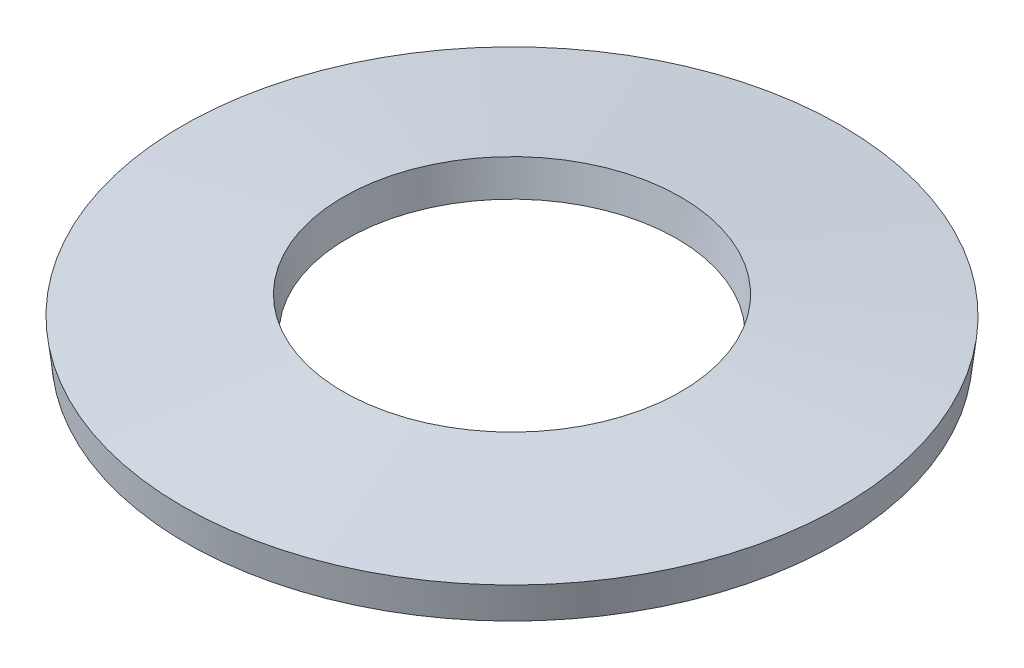
ISO-10303-21;
HEADER;
FILE_DESCRIPTION(('STEP AP214'),'2;1');
FILE_NAME('part.step','',(''),(''),'','','');
FILE_SCHEMA(('AUTOMOTIVE_DESIGN { 1 0 10303 214 1 1 1 1 }'));
ENDSEC;
DATA;
#1=APPLICATION_CONTEXT('core data for automotive mechanical design processes');
#2=APPLICATION_PROTOCOL_DEFINITION('international standard','automotive_design',2000,#1);
#3=PRODUCT_CONTEXT('',#1,'mechanical');
#4=PRODUCT('Part','Part','',(#3));
#5=PRODUCT_RELATED_PRODUCT_CATEGORY('part','',(#4));
#6=PRODUCT_DEFINITION_FORMATION('','',#4);
#7=PRODUCT_DEFINITION_CONTEXT('part definition',#1,'design');
#8=PRODUCT_DEFINITION('design','',#6,#7);
#9=PRODUCT_DEFINITION_SHAPE('','',#8);
#10=(LENGTH_UNIT() NAMED_UNIT(*) SI_UNIT(.MILLI.,.METRE.));
#11=(NAMED_UNIT(*) PLANE_ANGLE_UNIT() SI_UNIT($,.RADIAN.));
#12=(NAMED_UNIT(*) SI_UNIT($,.STERADIAN.) SOLID_ANGLE_UNIT());
#13=UNCERTAINTY_MEASURE_WITH_UNIT(LENGTH_MEASURE(1.E-05),#10,'distance_accuracy_value','');
#14=(GEOMETRIC_REPRESENTATION_CONTEXT(3) GLOBAL_UNCERTAINTY_ASSIGNED_CONTEXT((#13)) GLOBAL_UNIT_ASSIGNED_CONTEXT((#10,
#11,#12)) REPRESENTATION_CONTEXT('',''));
#15=CARTESIAN_POINT('',(0.,0.,0.));
#16=DIRECTION('',(0.,0.,1.));
#17=DIRECTION('',(1.,0.,0.));
#18=AXIS2_PLACEMENT_3D('',#15,#16,#17);
#19=CARTESIAN_POINT('',(0.,0.,0.));
#20=DIRECTION('',(0.,1.,0.));
#21=DIRECTION('',(0.,0.,1.));
#22=AXIS2_PLACEMENT_3D('',#19,#20,#21);
#23=CONICAL_SURFACE('',#22,3.13689420026131,0.115659874957986);
#24=CARTESIAN_POINT('',(0.,0.327993884129375,0.));
#25=DIRECTION('',(0.,-1.,0.));
#26=DIRECTION('',(0.,0.,-1.));
#27=AXIS2_PLACEMENT_3D('',#24,#25,#26);
#28=CIRCLE('',#27,3.175);
#29=CARTESIAN_POINT('',(0.,0.327993884129375,-3.175));
#30=VERTEX_POINT('',#29);
#31=EDGE_CURVE('E43',#30,#30,#28,.T.);
#32=ORIENTED_EDGE('',*,*,#31,.T.);
#33=EDGE_LOOP('',(#32));
#34=FACE_BOUND('',#33,.T.);
#35=CARTESIAN_POINT('',(0.,0.,0.));
#36=DIRECTION('',(0.,-1.,0.));
#37=DIRECTION('',(0.,0.,-1.));
#38=AXIS2_PLACEMENT_3D('',#35,#36,#37);
#39=CIRCLE('',#38,3.13689420026131);
#40=CARTESIAN_POINT('',(0.,0.,-3.13689420026131));
#41=VERTEX_POINT('',#40);
#42=EDGE_CURVE('E10',#41,#41,#39,.T.);
#43=ORIENTED_EDGE('',*,*,#42,.F.);
#44=EDGE_LOOP('',(#43));
#45=FACE_BOUND('',#44,.T.);
#46=ADVANCED_FACE('F29',(#34,#45),#23,.T.);
#47=CARTESIAN_POINT('',(0.,0.180006115870622,0.));
#48=DIRECTION('',(0.,-1.,0.));
#49=DIRECTION('',(0.,0.,-1.));
#50=AXIS2_PLACEMENT_3D('',#47,#48,#49);
#51=CONICAL_SURFACE('',#50,1.5875,1.4551364518369);
#52=ORIENTED_EDGE('',*,*,#42,.T.);
#53=EDGE_LOOP('',(#52));
#54=FACE_BOUND('',#53,.T.);
#55=CARTESIAN_POINT('',(0.,0.180006115870622,0.));
#56=DIRECTION('',(0.,-1.,0.));
#57=DIRECTION('',(0.,0.,-1.));
#58=AXIS2_PLACEMENT_3D('',#55,#56,#57);
#59=CIRCLE('',#58,1.5875);
#60=CARTESIAN_POINT('',(0.,0.180006115870622,-1.5875));
#61=VERTEX_POINT('',#60);
#62=EDGE_CURVE('E35',#61,#61,#59,.T.);
#63=ORIENTED_EDGE('',*,*,#62,.F.);
#64=EDGE_LOOP('',(#63));
#65=FACE_BOUND('',#64,.T.);
#66=ADVANCED_FACE('F59',(#54,#65),#51,.F.);
#67=CARTESIAN_POINT('',(0.,0.507999999999998,0.));
#68=DIRECTION('',(0.,1.,0.));
#69=DIRECTION('',(0.,0.,1.));
#70=AXIS2_PLACEMENT_3D('',#67,#68,#69);
#71=CONICAL_SURFACE('',#70,1.62560579973869,0.115659874958007);
#72=ORIENTED_EDGE('',*,*,#62,.T.);
#73=EDGE_LOOP('',(#72));
#74=FACE_BOUND('',#73,.T.);
#75=CARTESIAN_POINT('',(0.,0.507999999999998,0.));
#76=DIRECTION('',(0.,-1.,0.));
#77=DIRECTION('',(0.,0.,-1.));
#78=AXIS2_PLACEMENT_3D('',#75,#76,#77);
#79=CIRCLE('',#78,1.62560579973869);
#80=CARTESIAN_POINT('',(0.,0.507999999999998,-1.62560579973869));
#81=VERTEX_POINT('',#80);
#82=EDGE_CURVE('E39',#81,#81,#79,.T.);
#83=ORIENTED_EDGE('',*,*,#82,.F.);
#84=EDGE_LOOP('',(#83));
#85=FACE_BOUND('',#84,.T.);
#86=ADVANCED_FACE('F53',(#74,#85),#71,.F.);
#87=CARTESIAN_POINT('',(0.,0.327993884129375,0.));
#88=DIRECTION('',(0.,-1.,0.));
#89=DIRECTION('',(0.,0.,-1.));
#90=AXIS2_PLACEMENT_3D('',#87,#88,#89);
#91=CONICAL_SURFACE('',#90,3.175,1.4551364518369);
#92=ORIENTED_EDGE('',*,*,#82,.T.);
#93=EDGE_LOOP('',(#92));
#94=FACE_BOUND('',#93,.T.);
#95=ORIENTED_EDGE('',*,*,#31,.F.);
#96=EDGE_LOOP('',(#95));
#97=FACE_BOUND('',#96,.T.);
#98=ADVANCED_FACE('F51',(#94,#97),#91,.T.);
#99=CLOSED_SHELL('',(#46,#66,#86,#98));
#100=MANIFOLD_SOLID_BREP('B2',#99);
#101=ADVANCED_BREP_SHAPE_REPRESENTATION('',(#18,#100),#14);
#102=SHAPE_DEFINITION_REPRESENTATION(#9,#101);
ENDSEC;
END-ISO-10303-21;
